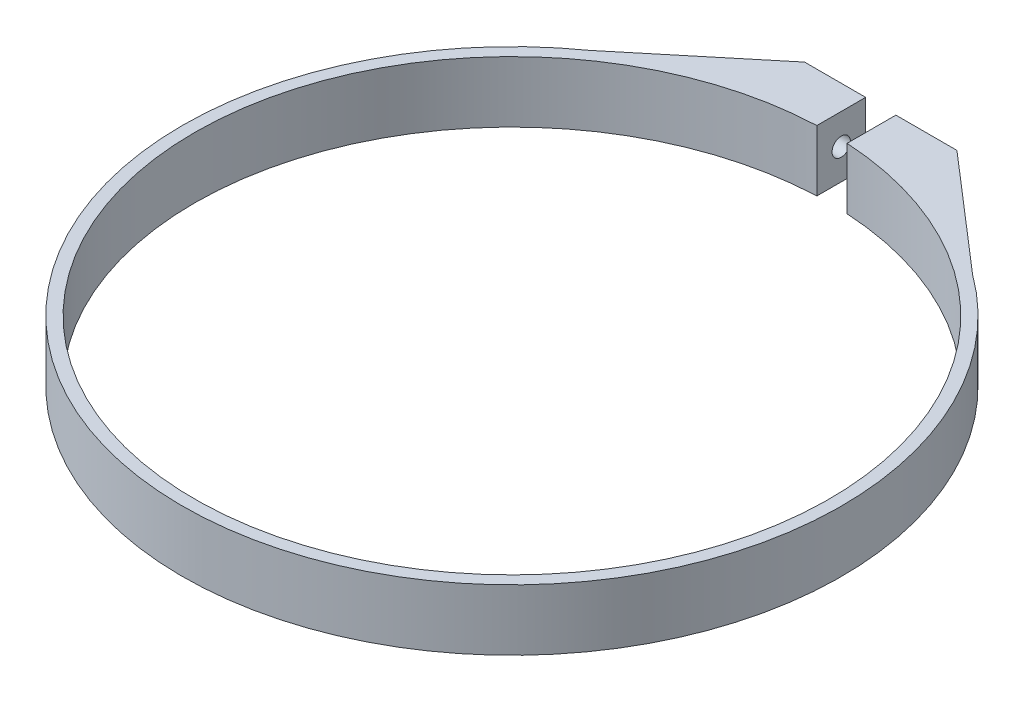
ISO-10303-21;
HEADER;
FILE_DESCRIPTION(('STEP AP214'),'2;1');
FILE_NAME('part.step','',(''),(''),'','','');
FILE_SCHEMA(('AUTOMOTIVE_DESIGN { 1 0 10303 214 1 1 1 1 }'));
ENDSEC;
DATA;
#1=APPLICATION_CONTEXT('core data for automotive mechanical design processes');
#2=APPLICATION_PROTOCOL_DEFINITION('international standard','automotive_design',2000,#1);
#3=PRODUCT_CONTEXT('',#1,'mechanical');
#4=PRODUCT('Part','Part','',(#3));
#5=PRODUCT_RELATED_PRODUCT_CATEGORY('part','',(#4));
#6=PRODUCT_DEFINITION_FORMATION('','',#4);
#7=PRODUCT_DEFINITION_CONTEXT('part definition',#1,'design');
#8=PRODUCT_DEFINITION('design','',#6,#7);
#9=PRODUCT_DEFINITION_SHAPE('','',#8);
#10=(LENGTH_UNIT() NAMED_UNIT(*) SI_UNIT(.MILLI.,.METRE.));
#11=(NAMED_UNIT(*) PLANE_ANGLE_UNIT() SI_UNIT($,.RADIAN.));
#12=(NAMED_UNIT(*) SI_UNIT($,.STERADIAN.) SOLID_ANGLE_UNIT());
#13=UNCERTAINTY_MEASURE_WITH_UNIT(LENGTH_MEASURE(1.E-05),#10,'distance_accuracy_value','');
#14=(GEOMETRIC_REPRESENTATION_CONTEXT(3) GLOBAL_UNCERTAINTY_ASSIGNED_CONTEXT((#13)) GLOBAL_UNIT_ASSIGNED_CONTEXT((#10,
#11,#12)) REPRESENTATION_CONTEXT('',''));
#15=CARTESIAN_POINT('',(0.,0.,0.));
#16=DIRECTION('',(0.,0.,1.));
#17=DIRECTION('',(1.,0.,0.));
#18=AXIS2_PLACEMENT_3D('',#15,#16,#17);
#19=CARTESIAN_POINT('',(-7.01027713781507,5.,-55.9611276420093));
#20=DIRECTION('',(1.,0.,0.));
#21=DIRECTION('',(0.,0.,-1.));
#22=AXIS2_PLACEMENT_3D('',#19,#20,#21);
#23=PLANE('',#22);
#24=CARTESIAN_POINT('',(-7.01027713781507,5.,-55.9611276420093));
#25=DIRECTION('',(1.,0.,0.));
#26=DIRECTION('',(0.,0.,-1.));
#27=AXIS2_PLACEMENT_3D('',#24,#25,#26);
#28=CIRCLE('',#27,2.5);
#29=CARTESIAN_POINT('',(-7.01027713781507,5.,-58.4611276420093));
#30=VERTEX_POINT('',#29);
#31=EDGE_CURVE('E19',#30,#30,#28,.F.);
#32=ORIENTED_EDGE('',*,*,#31,.T.);
#33=EDGE_LOOP('',(#32));
#34=FACE_BOUND('',#33,.T.);
#35=CARTESIAN_POINT('',(-7.01027713781507,5.,-55.9611276420093));
#36=DIRECTION('',(1.,0.,0.));
#37=DIRECTION('',(0.,0.,-1.));
#38=AXIS2_PLACEMENT_3D('',#35,#36,#37);
#39=CIRCLE('',#38,1.5);
#40=CARTESIAN_POINT('',(-7.01027713781507,5.,-57.4611276420093));
#41=VERTEX_POINT('',#40);
#42=EDGE_CURVE('E193',#41,#41,#39,.T.);
#43=ORIENTED_EDGE('',*,*,#42,.T.);
#44=EDGE_LOOP('',(#43));
#45=FACE_BOUND('',#44,.T.);
#46=ADVANCED_FACE('F16',(#34,#45),#23,.F.);
#47=CARTESIAN_POINT('',(-27.0102771378151,5.,-55.9611276420093));
#48=DIRECTION('',(1.,0.,0.));
#49=DIRECTION('',(0.,0.,-1.));
#50=AXIS2_PLACEMENT_3D('',#47,#48,#49);
#51=CYLINDRICAL_SURFACE('',#50,2.5);
#52=CARTESIAN_POINT('',(-16.8445165457642,5.,-55.9611276420093));
#53=DIRECTION('',(0.637496782736761,0.,0.770453017386705));
#54=DIRECTION('',(0.770453017386705,0.,-0.637496782736761));
#55=AXIS2_PLACEMENT_3D('',#52,#53,#54);
#56=ELLIPSE('',#55,3.92158841848198,2.5);
#57=CARTESIAN_POINT('',(-13.823116915796,5.,-58.4611276420093));
#58=VERTEX_POINT('',#57);
#59=EDGE_CURVE('E173',#58,#58,#56,.F.);
#60=ORIENTED_EDGE('',*,*,#59,.T.);
#61=EDGE_LOOP('',(#60));
#62=FACE_BOUND('',#61,.T.);
#63=ORIENTED_EDGE('',*,*,#31,.F.);
#64=EDGE_LOOP('',(#63));
#65=FACE_BOUND('',#64,.T.);
#66=ADVANCED_FACE('F201',(#62,#65),#51,.F.);
#67=CARTESIAN_POINT('',(2.98972286218493,5.,-55.9139822900086));
#68=DIRECTION('',(-1.,0.,0.));
#69=DIRECTION('',(0.,0.,1.));
#70=AXIS2_PLACEMENT_3D('',#67,#68,#69);
#71=CYLINDRICAL_SURFACE('',#70,1.24999999999999);
#72=CARTESIAN_POINT('',(17.6181173896479,5.,-55.9139822900086));
#73=DIRECTION('',(-0.653877337827255,0.,0.756600573007939));
#74=DIRECTION('',(-0.756600573007939,0.,-0.653877337827255));
#75=AXIS2_PLACEMENT_3D('',#72,#73,#74);
#76=ELLIPSE('',#75,1.91167353215447,1.24999999999999);
#77=CARTESIAN_POINT('',(16.1717440998158,5.,-57.1639822900086));
#78=VERTEX_POINT('',#77);
#79=EDGE_CURVE('E170',#78,#78,#76,.F.);
#80=ORIENTED_EDGE('',*,*,#79,.T.);
#81=EDGE_LOOP('',(#80));
#82=FACE_BOUND('',#81,.T.);
#83=CARTESIAN_POINT('',(2.98972286218493,5.,-55.9139822900086));
#84=DIRECTION('',(-1.,0.,0.));
#85=DIRECTION('',(0.,0.,1.));
#86=AXIS2_PLACEMENT_3D('',#83,#84,#85);
#87=CIRCLE('',#86,1.24999999999999);
#88=CARTESIAN_POINT('',(2.98972286218493,5.,-54.6639822900086));
#89=VERTEX_POINT('',#88);
#90=EDGE_CURVE('E162',#89,#89,#87,.T.);
#91=ORIENTED_EDGE('',*,*,#90,.T.);
#92=EDGE_LOOP('',(#91));
#93=FACE_BOUND('',#92,.T.);
#94=ADVANCED_FACE('F203',(#82,#93),#71,.F.);
#95=CARTESIAN_POINT('',(-7.01027713781507,5.,-55.9611276420093));
#96=DIRECTION('',(1.,0.,0.));
#97=DIRECTION('',(0.,0.,-1.));
#98=AXIS2_PLACEMENT_3D('',#95,#96,#97);
#99=CYLINDRICAL_SURFACE('',#98,1.5);
#100=ORIENTED_EDGE('',*,*,#42,.F.);
#101=EDGE_LOOP('',(#100));
#102=FACE_BOUND('',#101,.T.);
#103=CARTESIAN_POINT('',(-2.01027713781507,5.,-55.9611276420093));
#104=DIRECTION('',(1.,0.,0.));
#105=DIRECTION('',(0.,0.,-1.));
#106=AXIS2_PLACEMENT_3D('',#103,#104,#105);
#107=CIRCLE('',#106,1.5);
#108=CARTESIAN_POINT('',(-2.01027713781507,5.,-57.4611276420093));
#109=VERTEX_POINT('',#108);
#110=EDGE_CURVE('E127',#109,#109,#107,.T.);
#111=ORIENTED_EDGE('',*,*,#110,.T.);
#112=EDGE_LOOP('',(#111));
#113=FACE_BOUND('',#112,.T.);
#114=ADVANCED_FACE('F210',(#102,#113),#99,.F.);
#115=CARTESIAN_POINT('',(-12.0102771378151,10.,-59.9611276420093));
#116=DIRECTION('',(0.637496782736761,0.,0.770453017386705));
#117=DIRECTION('',(0.770453017386705,0.,-0.637496782736761));
#118=AXIS2_PLACEMENT_3D('',#115,#116,#117);
#119=PLANE('',#118);
#120=DIRECTION('',(0.,-1.,0.));
#121=VECTOR('',#120,1.);
#122=CARTESIAN_POINT('',(-31.2716025724827,10.,-44.0237080735902));
#123=LINE('',#122,#121);
#124=CARTESIAN_POINT('',(-31.2716025724827,10.,-44.0237080735902));
#125=VERTEX_POINT('',#124);
#126=CARTESIAN_POINT('',(-31.2716025724827,0.,-44.0237080735902));
#127=VERTEX_POINT('',#126);
#128=EDGE_CURVE('E171',#125,#127,#123,.T.);
#129=ORIENTED_EDGE('',*,*,#128,.F.);
#130=DIRECTION('',(-0.770453017386705,0.,0.637496782736761));
#131=VECTOR('',#130,1.);
#132=CARTESIAN_POINT('',(-12.0102771378151,10.,-59.9611276420093));
#133=LINE('',#132,#131);
#134=CARTESIAN_POINT('',(-12.0102771378151,10.,-59.9611276420093));
#135=VERTEX_POINT('',#134);
#136=EDGE_CURVE('E61',#135,#125,#133,.T.);
#137=ORIENTED_EDGE('',*,*,#136,.F.);
#138=DIRECTION('',(0.,1.,0.));
#139=VECTOR('',#138,1.);
#140=CARTESIAN_POINT('',(-12.0102771378151,10.,-59.9611276420093));
#141=LINE('',#140,#139);
#142=CARTESIAN_POINT('',(-12.0102771378151,0.,-59.9611276420093));
#143=VERTEX_POINT('',#142);
#144=EDGE_CURVE('E70',#135,#143,#141,.F.);
#145=ORIENTED_EDGE('',*,*,#144,.T.);
#146=DIRECTION('',(-0.770453017386705,0.,0.637496782736761));
#147=VECTOR('',#146,1.);
#148=CARTESIAN_POINT('',(-12.0102771378151,0.,-59.9611276420093));
#149=LINE('',#148,#147);
#150=EDGE_CURVE('E117',#143,#127,#149,.T.);
#151=ORIENTED_EDGE('',*,*,#150,.T.);
#152=EDGE_LOOP('',(#129,#137,#145,#151));
#153=FACE_BOUND('',#152,.T.);
#154=ORIENTED_EDGE('',*,*,#59,.F.);
#155=EDGE_LOOP('',(#154));
#156=FACE_BOUND('',#155,.T.);
#157=ADVANCED_FACE('F244',(#153,#156),#119,.F.);
#158=CARTESIAN_POINT('',(0.,10.,0.));
#159=DIRECTION('',(0.,-1.,0.));
#160=DIRECTION('',(0.,0.,-1.));
#161=AXIS2_PLACEMENT_3D('',#158,#159,#160);
#162=CYLINDRICAL_SURFACE('',#161,54.);
#163=CARTESIAN_POINT('',(0.,10.,0.));
#164=DIRECTION('',(0.,-1.,0.));
#165=DIRECTION('',(0.,0.,-1.));
#166=AXIS2_PLACEMENT_3D('',#163,#164,#165);
#167=CIRCLE('',#166,54.);
#168=CARTESIAN_POINT('',(31.9047371873834,10.,-43.5670488443273));
#169=VERTEX_POINT('',#168);
#170=EDGE_CURVE('E148',#125,#169,#167,.F.);
#171=ORIENTED_EDGE('',*,*,#170,.F.);
#172=ORIENTED_EDGE('',*,*,#128,.T.);
#173=CARTESIAN_POINT('',(0.,0.,0.));
#174=DIRECTION('',(0.,-1.,0.));
#175=DIRECTION('',(0.,0.,-1.));
#176=AXIS2_PLACEMENT_3D('',#173,#174,#175);
#177=CIRCLE('',#176,54.);
#178=CARTESIAN_POINT('',(31.9047371873834,0.,-43.5670488443273));
#179=VERTEX_POINT('',#178);
#180=EDGE_CURVE('E115',#127,#179,#177,.F.);
#181=ORIENTED_EDGE('',*,*,#180,.T.);
#182=DIRECTION('',(0.,1.,0.));
#183=VECTOR('',#182,1.);
#184=CARTESIAN_POINT('',(31.9047371873834,10.,-43.5670488443273));
#185=LINE('',#184,#183);
#186=EDGE_CURVE('E103',#179,#169,#185,.T.);
#187=ORIENTED_EDGE('',*,*,#186,.T.);
#188=EDGE_LOOP('',(#171,#172,#181,#187));
#189=FACE_BOUND('',#188,.T.);
#190=ADVANCED_FACE('F241',(#189),#162,.T.);
#191=CARTESIAN_POINT('',(12.9897228621849,10.,-59.9139822900086));
#192=DIRECTION('',(-0.653877337827255,0.,0.756600573007939));
#193=DIRECTION('',(0.756600573007939,0.,0.653877337827255));
#194=AXIS2_PLACEMENT_3D('',#191,#192,#193);
#195=PLANE('',#194);
#196=DIRECTION('',(0.,1.,0.));
#197=VECTOR('',#196,1.);
#198=CARTESIAN_POINT('',(12.9897228621849,10.,-59.9139822900086));
#199=LINE('',#198,#197);
#200=CARTESIAN_POINT('',(12.9897228621849,0.,-59.9139822900086));
#201=VERTEX_POINT('',#200);
#202=CARTESIAN_POINT('',(12.9897228621849,10.,-59.9139822900086));
#203=VERTEX_POINT('',#202);
#204=EDGE_CURVE('E97',#201,#203,#199,.T.);
#205=ORIENTED_EDGE('',*,*,#204,.T.);
#206=DIRECTION('',(-0.756600573007939,0.,-0.653877337827256));
#207=VECTOR('',#206,1.);
#208=CARTESIAN_POINT('',(31.9047371873834,10.,-43.5670488443273));
#209=LINE('',#208,#207);
#210=EDGE_CURVE('E77',#169,#203,#209,.T.);
#211=ORIENTED_EDGE('',*,*,#210,.F.);
#212=ORIENTED_EDGE('',*,*,#186,.F.);
#213=DIRECTION('',(-0.756600573007939,0.,-0.653877337827256));
#214=VECTOR('',#213,1.);
#215=CARTESIAN_POINT('',(31.9047371873834,0.,-43.5670488443273));
#216=LINE('',#215,#214);
#217=EDGE_CURVE('E108',#179,#201,#216,.T.);
#218=ORIENTED_EDGE('',*,*,#217,.T.);
#219=EDGE_LOOP('',(#205,#211,#212,#218));
#220=FACE_BOUND('',#219,.T.);
#221=ORIENTED_EDGE('',*,*,#79,.F.);
#222=EDGE_LOOP('',(#221));
#223=FACE_BOUND('',#222,.T.);
#224=ADVANCED_FACE('F112',(#220,#223),#195,.F.);
#225=CARTESIAN_POINT('',(2.98972286218493,10.,-59.9139822900086));
#226=DIRECTION('',(0.,0.,1.));
#227=DIRECTION('',(1.,0.,0.));
#228=AXIS2_PLACEMENT_3D('',#225,#226,#227);
#229=PLANE('',#228);
#230=DIRECTION('',(0.,1.,0.));
#231=VECTOR('',#230,1.);
#232=CARTESIAN_POINT('',(2.98972286218493,10.,-59.9139822900086));
#233=LINE('',#232,#231);
#234=CARTESIAN_POINT('',(2.98972286218493,0.,-59.9139822900086));
#235=VERTEX_POINT('',#234);
#236=CARTESIAN_POINT('',(2.98972286218493,10.,-59.9139822900086));
#237=VERTEX_POINT('',#236);
#238=EDGE_CURVE('E91',#235,#237,#233,.T.);
#239=ORIENTED_EDGE('',*,*,#238,.T.);
#240=DIRECTION('',(1.,0.,0.));
#241=VECTOR('',#240,1.);
#242=CARTESIAN_POINT('',(0.,10.,-59.9139822900086));
#243=LINE('',#242,#241);
#244=EDGE_CURVE('E82',#203,#237,#243,.F.);
#245=ORIENTED_EDGE('',*,*,#244,.F.);
#246=ORIENTED_EDGE('',*,*,#204,.F.);
#247=DIRECTION('',(1.,0.,0.));
#248=VECTOR('',#247,1.);
#249=CARTESIAN_POINT('',(0.,0.,-59.9139822900086));
#250=LINE('',#249,#248);
#251=EDGE_CURVE('E100',#201,#235,#250,.F.);
#252=ORIENTED_EDGE('',*,*,#251,.T.);
#253=EDGE_LOOP('',(#239,#245,#246,#252));
#254=FACE_BOUND('',#253,.T.);
#255=ADVANCED_FACE('F99',(#254),#229,.F.);
#256=CARTESIAN_POINT('',(-2.01027713781507,10.,-59.9611276420093));
#257=DIRECTION('',(0.,0.,1.));
#258=DIRECTION('',(1.,0.,0.));
#259=AXIS2_PLACEMENT_3D('',#256,#257,#258);
#260=PLANE('',#259);
#261=ORIENTED_EDGE('',*,*,#144,.F.);
#262=DIRECTION('',(1.,0.,0.));
#263=VECTOR('',#262,1.);
#264=CARTESIAN_POINT('',(0.,10.,-59.9611276420093));
#265=LINE('',#264,#263);
#266=CARTESIAN_POINT('',(-2.01027713781507,10.,-59.9611276420093));
#267=VERTEX_POINT('',#266);
#268=EDGE_CURVE('E152',#267,#135,#265,.F.);
#269=ORIENTED_EDGE('',*,*,#268,.F.);
#270=DIRECTION('',(0.,1.,0.));
#271=VECTOR('',#270,1.);
#272=CARTESIAN_POINT('',(-2.01027713781507,10.,-59.9611276420093));
#273=LINE('',#272,#271);
#274=CARTESIAN_POINT('',(-2.01027713781506,0.,-59.9611276420093));
#275=VERTEX_POINT('',#274);
#276=EDGE_CURVE('E140',#267,#275,#273,.F.);
#277=ORIENTED_EDGE('',*,*,#276,.T.);
#278=DIRECTION('',(1.,0.,0.));
#279=VECTOR('',#278,1.);
#280=CARTESIAN_POINT('',(0.,0.,-59.9611276420093));
#281=LINE('',#280,#279);
#282=EDGE_CURVE('E136',#275,#143,#281,.F.);
#283=ORIENTED_EDGE('',*,*,#282,.T.);
#284=EDGE_LOOP('',(#261,#269,#277,#283));
#285=FACE_BOUND('',#284,.T.);
#286=ADVANCED_FACE('F234',(#285),#260,.F.);
#287=CARTESIAN_POINT('',(2.98972286218493,10.,-59.9139822900086));
#288=DIRECTION('',(1.,0.,0.));
#289=DIRECTION('',(0.,0.,-1.));
#290=AXIS2_PLACEMENT_3D('',#287,#288,#289);
#291=PLANE('',#290);
#292=DIRECTION('',(0.,-1.,0.));
#293=VECTOR('',#292,1.);
#294=CARTESIAN_POINT('',(2.98972286218493,10.,-51.9139822900086));
#295=LINE('',#294,#293);
#296=CARTESIAN_POINT('',(2.98972286218493,0.,-51.9139822900086));
#297=VERTEX_POINT('',#296);
#298=CARTESIAN_POINT('',(2.98972286218493,10.,-51.9139822900086));
#299=VERTEX_POINT('',#298);
#300=EDGE_CURVE('E133',#297,#299,#295,.F.);
#301=ORIENTED_EDGE('',*,*,#300,.T.);
#302=DIRECTION('',(0.,0.,1.));
#303=VECTOR('',#302,1.);
#304=CARTESIAN_POINT('',(2.98972286218493,10.,0.));
#305=LINE('',#304,#303);
#306=EDGE_CURVE('E141',#237,#299,#305,.T.);
#307=ORIENTED_EDGE('',*,*,#306,.F.);
#308=ORIENTED_EDGE('',*,*,#238,.F.);
#309=DIRECTION('',(0.,0.,1.));
#310=VECTOR('',#309,1.);
#311=CARTESIAN_POINT('',(2.98972286218493,0.,0.));
#312=LINE('',#311,#310);
#313=EDGE_CURVE('E110',#235,#297,#312,.T.);
#314=ORIENTED_EDGE('',*,*,#313,.T.);
#315=EDGE_LOOP('',(#301,#307,#308,#314));
#316=FACE_BOUND('',#315,.T.);
#317=ORIENTED_EDGE('',*,*,#90,.F.);
#318=EDGE_LOOP('',(#317));
#319=FACE_BOUND('',#318,.T.);
#320=ADVANCED_FACE('F231',(#316,#319),#291,.F.);
#321=CARTESIAN_POINT('',(0.,10.,0.));
#322=DIRECTION('',(0.,1.,0.));
#323=DIRECTION('',(0.,0.,1.));
#324=AXIS2_PLACEMENT_3D('',#321,#322,#323);
#325=PLANE('',#324);
#326=CARTESIAN_POINT('',(0.,10.,0.));
#327=DIRECTION('',(0.,-1.,0.));
#328=DIRECTION('',(0.,0.,-1.));
#329=AXIS2_PLACEMENT_3D('',#326,#327,#328);
#330=CIRCLE('',#329,52.);
#331=CARTESIAN_POINT('',(-2.01027713781506,10.,-51.9611276420093));
#332=VERTEX_POINT('',#331);
#333=EDGE_CURVE('E132',#299,#332,#330,.T.);
#334=ORIENTED_EDGE('',*,*,#333,.T.);
#335=DIRECTION('',(0.,0.,1.));
#336=VECTOR('',#335,1.);
#337=CARTESIAN_POINT('',(-2.01027713781507,10.,-59.9611276420093));
#338=LINE('',#337,#336);
#339=EDGE_CURVE('E137',#332,#267,#338,.F.);
#340=ORIENTED_EDGE('',*,*,#339,.T.);
#341=ORIENTED_EDGE('',*,*,#268,.T.);
#342=ORIENTED_EDGE('',*,*,#136,.T.);
#343=ORIENTED_EDGE('',*,*,#170,.T.);
#344=ORIENTED_EDGE('',*,*,#210,.T.);
#345=ORIENTED_EDGE('',*,*,#244,.T.);
#346=ORIENTED_EDGE('',*,*,#306,.T.);
#347=EDGE_LOOP('',(#334,#340,#341,#342,#343,#344,#345,#346));
#348=FACE_BOUND('',#347,.T.);
#349=ADVANCED_FACE('F227',(#348),#325,.T.);
#350=CARTESIAN_POINT('',(-2.01027713781507,10.,-59.9611276420093));
#351=DIRECTION('',(-1.,0.,0.));
#352=DIRECTION('',(0.,0.,1.));
#353=AXIS2_PLACEMENT_3D('',#350,#351,#352);
#354=PLANE('',#353);
#355=ORIENTED_EDGE('',*,*,#110,.F.);
#356=EDGE_LOOP('',(#355));
#357=FACE_BOUND('',#356,.T.);
#358=ORIENTED_EDGE('',*,*,#276,.F.);
#359=ORIENTED_EDGE('',*,*,#339,.F.);
#360=DIRECTION('',(0.,-1.,0.));
#361=VECTOR('',#360,1.);
#362=CARTESIAN_POINT('',(-2.01027713781505,10.,-51.9611276420093));
#363=LINE('',#362,#361);
#364=CARTESIAN_POINT('',(-2.01027713781505,0.,-51.9611276420093));
#365=VERTEX_POINT('',#364);
#366=EDGE_CURVE('E25',#332,#365,#363,.T.);
#367=ORIENTED_EDGE('',*,*,#366,.T.);
#368=DIRECTION('',(0.,0.,1.));
#369=VECTOR('',#368,1.);
#370=CARTESIAN_POINT('',(-2.01027713781506,0.,0.));
#371=LINE('',#370,#369);
#372=EDGE_CURVE('E33',#365,#275,#371,.F.);
#373=ORIENTED_EDGE('',*,*,#372,.T.);
#374=EDGE_LOOP('',(#358,#359,#367,#373));
#375=FACE_BOUND('',#374,.T.);
#376=ADVANCED_FACE('F221',(#357,#375),#354,.F.);
#377=CARTESIAN_POINT('',(0.,0.,0.));
#378=DIRECTION('',(0.,1.,0.));
#379=DIRECTION('',(0.,0.,1.));
#380=AXIS2_PLACEMENT_3D('',#377,#378,#379);
#381=PLANE('',#380);
#382=ORIENTED_EDGE('',*,*,#372,.F.);
#383=CARTESIAN_POINT('',(0.,0.,0.));
#384=DIRECTION('',(0.,-1.,0.));
#385=DIRECTION('',(0.,0.,-1.));
#386=AXIS2_PLACEMENT_3D('',#383,#384,#385);
#387=CIRCLE('',#386,52.);
#388=EDGE_CURVE('E11',#365,#297,#387,.F.);
#389=ORIENTED_EDGE('',*,*,#388,.T.);
#390=ORIENTED_EDGE('',*,*,#313,.F.);
#391=ORIENTED_EDGE('',*,*,#251,.F.);
#392=ORIENTED_EDGE('',*,*,#217,.F.);
#393=ORIENTED_EDGE('',*,*,#180,.F.);
#394=ORIENTED_EDGE('',*,*,#150,.F.);
#395=ORIENTED_EDGE('',*,*,#282,.F.);
#396=EDGE_LOOP('',(#382,#389,#390,#391,#392,#393,#394,#395));
#397=FACE_BOUND('',#396,.T.);
#398=ADVANCED_FACE('F106',(#397),#381,.F.);
#399=CARTESIAN_POINT('',(0.,10.,0.));
#400=DIRECTION('',(0.,-1.,0.));
#401=DIRECTION('',(0.,0.,-1.));
#402=AXIS2_PLACEMENT_3D('',#399,#400,#401);
#403=CYLINDRICAL_SURFACE('',#402,52.);
#404=ORIENTED_EDGE('',*,*,#366,.F.);
#405=ORIENTED_EDGE('',*,*,#333,.F.);
#406=ORIENTED_EDGE('',*,*,#300,.F.);
#407=ORIENTED_EDGE('',*,*,#388,.F.);
#408=EDGE_LOOP('',(#404,#405,#406,#407));
#409=FACE_BOUND('',#408,.T.);
#410=ADVANCED_FACE('F214',(#409),#403,.F.);
#411=CLOSED_SHELL('',(#46,#66,#94,#114,#157,#190,#224,#255,#286,#320,#349,#376,#398,#410));
#412=MANIFOLD_SOLID_BREP('B1',#411);
#413=ADVANCED_BREP_SHAPE_REPRESENTATION('',(#18,#412),#14);
#414=SHAPE_DEFINITION_REPRESENTATION(#9,#413);
ENDSEC;
END-ISO-10303-21;
